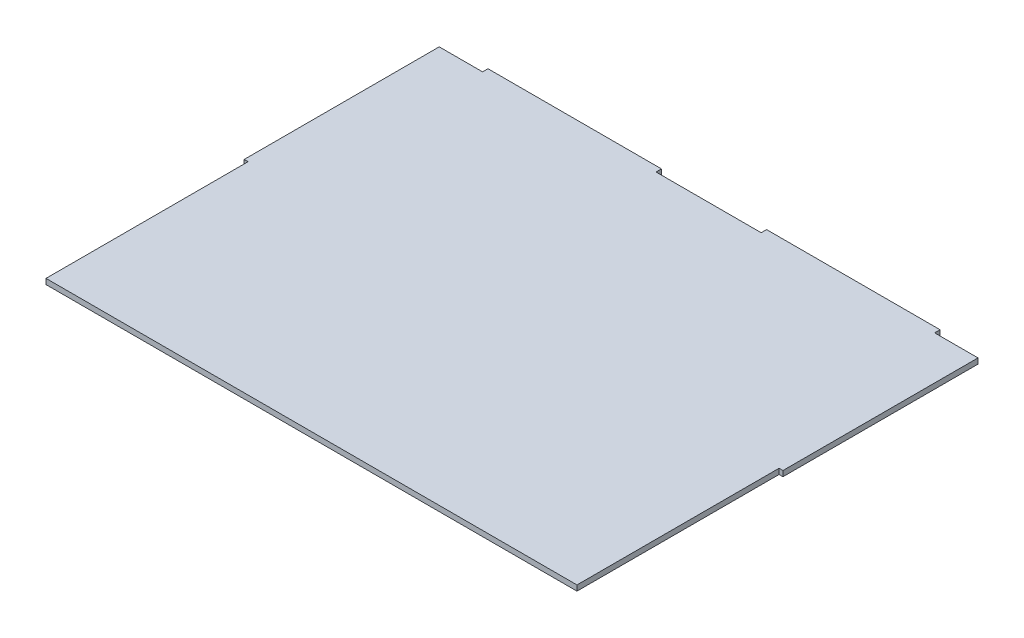
ISO-10303-21;
HEADER;
FILE_DESCRIPTION(('STEP AP214'),'2;1');
FILE_NAME('part.step','',(''),(''),'','','');
FILE_SCHEMA(('AUTOMOTIVE_DESIGN { 1 0 10303 214 1 1 1 1 }'));
ENDSEC;
DATA;
#1=APPLICATION_CONTEXT('core data for automotive mechanical design processes');
#2=APPLICATION_PROTOCOL_DEFINITION('international standard','automotive_design',2000,#1);
#3=PRODUCT_CONTEXT('',#1,'mechanical');
#4=PRODUCT('Part','Part','',(#3));
#5=PRODUCT_RELATED_PRODUCT_CATEGORY('part','',(#4));
#6=PRODUCT_DEFINITION_FORMATION('','',#4);
#7=PRODUCT_DEFINITION_CONTEXT('part definition',#1,'design');
#8=PRODUCT_DEFINITION('design','',#6,#7);
#9=PRODUCT_DEFINITION_SHAPE('','',#8);
#10=(LENGTH_UNIT() NAMED_UNIT(*) SI_UNIT(.MILLI.,.METRE.));
#11=(NAMED_UNIT(*) PLANE_ANGLE_UNIT() SI_UNIT($,.RADIAN.));
#12=(NAMED_UNIT(*) SI_UNIT($,.STERADIAN.) SOLID_ANGLE_UNIT());
#13=UNCERTAINTY_MEASURE_WITH_UNIT(LENGTH_MEASURE(1.E-05),#10,'distance_accuracy_value','');
#14=(GEOMETRIC_REPRESENTATION_CONTEXT(3) GLOBAL_UNCERTAINTY_ASSIGNED_CONTEXT((#13)) GLOBAL_UNIT_ASSIGNED_CONTEXT((#10,
#11,#12)) REPRESENTATION_CONTEXT('',''));
#15=CARTESIAN_POINT('',(0.,0.,0.));
#16=DIRECTION('',(0.,0.,1.));
#17=DIRECTION('',(1.,0.,0.));
#18=AXIS2_PLACEMENT_3D('',#15,#16,#17);
#19=CARTESIAN_POINT('',(-157.7875,1.5875,235.775));
#20=DIRECTION('',(0.,-1.,0.));
#21=DIRECTION('',(0.,0.,-1.));
#22=AXIS2_PLACEMENT_3D('',#19,#20,#21);
#23=PLANE('',#22);
#24=DIRECTION('',(-1.,0.,0.));
#25=VECTOR('',#24,1.);
#26=CARTESIAN_POINT('',(-157.7875,1.5875,117.411));
#27=LINE('',#26,#25);
#28=CARTESIAN_POINT('',(157.7875,1.5875,117.411));
#29=VERTEX_POINT('',#28);
#30=CARTESIAN_POINT('',(155.5015,1.5875,117.411));
#31=VERTEX_POINT('',#30);
#32=EDGE_CURVE('E156',#29,#31,#27,.T.);
#33=ORIENTED_EDGE('',*,*,#32,.F.);
#34=DIRECTION('',(0.,0.,-1.));
#35=VECTOR('',#34,1.);
#36=CARTESIAN_POINT('',(157.7875,1.5875,235.775));
#37=LINE('',#36,#35);
#38=CARTESIAN_POINT('',(157.7875,1.5875,3.175));
#39=VERTEX_POINT('',#38);
#40=EDGE_CURVE('E273',#29,#39,#37,.T.);
#41=ORIENTED_EDGE('',*,*,#40,.T.);
#42=DIRECTION('',(1.,0.,0.));
#43=VECTOR('',#42,1.);
#44=CARTESIAN_POINT('',(0.,1.5875,3.175));
#45=LINE('',#44,#43);
#46=CARTESIAN_POINT('',(132.3875,1.5875,3.175));
#47=VERTEX_POINT('',#46);
#48=EDGE_CURVE('E200',#47,#39,#45,.T.);
#49=ORIENTED_EDGE('',*,*,#48,.F.);
#50=DIRECTION('',(0.,0.,-1.));
#51=VECTOR('',#50,1.);
#52=CARTESIAN_POINT('',(132.3875,1.5875,3.175));
#53=LINE('',#52,#51);
#54=CARTESIAN_POINT('',(132.3875,1.5875,0.));
#55=VERTEX_POINT('',#54);
#56=EDGE_CURVE('E209',#47,#55,#53,.T.);
#57=ORIENTED_EDGE('',*,*,#56,.T.);
#58=DIRECTION('',(-1.,0.,0.));
#59=VECTOR('',#58,1.);
#60=CARTESIAN_POINT('',(-157.7875,1.5875,0.));
#61=LINE('',#60,#59);
#62=CARTESIAN_POINT('',(30.7875000000001,1.5875,0.));
#63=VERTEX_POINT('',#62);
#64=EDGE_CURVE('E264',#55,#63,#61,.T.);
#65=ORIENTED_EDGE('',*,*,#64,.T.);
#66=DIRECTION('',(0.,0.,-1.));
#67=VECTOR('',#66,1.);
#68=CARTESIAN_POINT('',(30.7875000000001,1.5875,3.175));
#69=LINE('',#68,#67);
#70=CARTESIAN_POINT('',(30.7875000000001,1.5875,3.175));
#71=VERTEX_POINT('',#70);
#72=EDGE_CURVE('E234',#71,#63,#69,.T.);
#73=ORIENTED_EDGE('',*,*,#72,.F.);
#74=DIRECTION('',(1.,0.,0.));
#75=VECTOR('',#74,1.);
#76=CARTESIAN_POINT('',(0.,1.5875,3.175));
#77=LINE('',#76,#75);
#78=CARTESIAN_POINT('',(-30.7875000000001,1.5875,3.175));
#79=VERTEX_POINT('',#78);
#80=EDGE_CURVE('E221',#79,#71,#77,.T.);
#81=ORIENTED_EDGE('',*,*,#80,.F.);
#82=DIRECTION('',(0.,0.,-1.));
#83=VECTOR('',#82,1.);
#84=CARTESIAN_POINT('',(-30.7875000000001,1.5875,3.175));
#85=LINE('',#84,#83);
#86=CARTESIAN_POINT('',(-30.7875000000001,1.5875,0.));
#87=VERTEX_POINT('',#86);
#88=EDGE_CURVE('E236',#79,#87,#85,.T.);
#89=ORIENTED_EDGE('',*,*,#88,.T.);
#90=CARTESIAN_POINT('',(-132.3875,1.5875,0.));
#91=VERTEX_POINT('',#90);
#92=EDGE_CURVE('E212',#87,#91,#61,.T.);
#93=ORIENTED_EDGE('',*,*,#92,.T.);
#94=DIRECTION('',(0.,0.,-1.));
#95=VECTOR('',#94,1.);
#96=CARTESIAN_POINT('',(-132.3875,1.5875,3.175));
#97=LINE('',#96,#95);
#98=CARTESIAN_POINT('',(-132.3875,1.5875,3.175));
#99=VERTEX_POINT('',#98);
#100=EDGE_CURVE('E229',#99,#91,#97,.T.);
#101=ORIENTED_EDGE('',*,*,#100,.F.);
#102=DIRECTION('',(1.,0.,0.));
#103=VECTOR('',#102,1.);
#104=CARTESIAN_POINT('',(0.,1.5875,3.175));
#105=LINE('',#104,#103);
#106=CARTESIAN_POINT('',(-157.7875,1.5875,3.175));
#107=VERTEX_POINT('',#106);
#108=EDGE_CURVE('E248',#107,#99,#105,.T.);
#109=ORIENTED_EDGE('',*,*,#108,.F.);
#110=DIRECTION('',(0.,0.,-1.));
#111=VECTOR('',#110,1.);
#112=CARTESIAN_POINT('',(-157.7875,1.5875,235.775));
#113=LINE('',#112,#111);
#114=CARTESIAN_POINT('',(-157.7875,1.5875,117.411));
#115=VERTEX_POINT('',#114);
#116=EDGE_CURVE('E271',#115,#107,#113,.T.);
#117=ORIENTED_EDGE('',*,*,#116,.F.);
#118=DIRECTION('',(1.,0.,0.));
#119=VECTOR('',#118,1.);
#120=CARTESIAN_POINT('',(-157.7875,1.5875,117.411));
#121=LINE('',#120,#119);
#122=CARTESIAN_POINT('',(-155.5015,1.5875,117.411));
#123=VERTEX_POINT('',#122);
#124=EDGE_CURVE('E189',#115,#123,#121,.T.);
#125=ORIENTED_EDGE('',*,*,#124,.T.);
#126=DIRECTION('',(0.,0.,-1.));
#127=VECTOR('',#126,1.);
#128=CARTESIAN_POINT('',(-155.5015,1.5875,235.775));
#129=LINE('',#128,#127);
#130=CARTESIAN_POINT('',(-155.5015,1.5875,235.775));
#131=VERTEX_POINT('',#130);
#132=EDGE_CURVE('E187',#131,#123,#129,.T.);
#133=ORIENTED_EDGE('',*,*,#132,.F.);
#134=DIRECTION('',(-1.,0.,0.));
#135=VECTOR('',#134,1.);
#136=CARTESIAN_POINT('',(-157.7875,1.5875,235.775));
#137=LINE('',#136,#135);
#138=CARTESIAN_POINT('',(155.5015,1.5875,235.775));
#139=VERTEX_POINT('',#138);
#140=EDGE_CURVE('E257',#139,#131,#137,.T.);
#141=ORIENTED_EDGE('',*,*,#140,.F.);
#142=DIRECTION('',(0.,0.,-1.));
#143=VECTOR('',#142,1.);
#144=CARTESIAN_POINT('',(155.5015,1.5875,235.775));
#145=LINE('',#144,#143);
#146=EDGE_CURVE('E177',#139,#31,#145,.T.);
#147=ORIENTED_EDGE('',*,*,#146,.T.);
#148=EDGE_LOOP('',(#33,#41,#49,#57,#65,#73,#81,#89,#93,#101,#109,#117,#125,#133,#141,#147));
#149=FACE_BOUND('',#148,.T.);
#150=ADVANCED_FACE('F41',(#149),#23,.F.);
#151=CARTESIAN_POINT('',(-157.7875,-1.5875,235.775));
#152=DIRECTION('',(0.,1.,0.));
#153=DIRECTION('',(0.,0.,1.));
#154=AXIS2_PLACEMENT_3D('',#151,#152,#153);
#155=PLANE('',#154);
#156=DIRECTION('',(-1.,0.,0.));
#157=VECTOR('',#156,1.);
#158=CARTESIAN_POINT('',(0.,-1.5875,117.411));
#159=LINE('',#158,#157);
#160=CARTESIAN_POINT('',(157.7875,-1.5875,117.411));
#161=VERTEX_POINT('',#160);
#162=CARTESIAN_POINT('',(155.5015,-1.5875,117.411));
#163=VERTEX_POINT('',#162);
#164=EDGE_CURVE('E55',#161,#163,#159,.T.);
#165=ORIENTED_EDGE('',*,*,#164,.T.);
#166=DIRECTION('',(0.,0.,-1.));
#167=VECTOR('',#166,1.);
#168=CARTESIAN_POINT('',(155.5015,-1.5875,0.));
#169=LINE('',#168,#167);
#170=CARTESIAN_POINT('',(155.5015,-1.5875,235.775));
#171=VERTEX_POINT('',#170);
#172=EDGE_CURVE('E162',#171,#163,#169,.T.);
#173=ORIENTED_EDGE('',*,*,#172,.F.);
#174=DIRECTION('',(1.,0.,0.));
#175=VECTOR('',#174,1.);
#176=CARTESIAN_POINT('',(-157.7875,-1.5875,235.775));
#177=LINE('',#176,#175);
#178=CARTESIAN_POINT('',(-155.5015,-1.5875,235.775));
#179=VERTEX_POINT('',#178);
#180=EDGE_CURVE('E259',#179,#171,#177,.T.);
#181=ORIENTED_EDGE('',*,*,#180,.F.);
#182=DIRECTION('',(0.,0.,-1.));
#183=VECTOR('',#182,1.);
#184=CARTESIAN_POINT('',(-155.5015,-1.5875,0.));
#185=LINE('',#184,#183);
#186=CARTESIAN_POINT('',(-155.5015,-1.5875,117.411));
#187=VERTEX_POINT('',#186);
#188=EDGE_CURVE('E63',#179,#187,#185,.T.);
#189=ORIENTED_EDGE('',*,*,#188,.T.);
#190=DIRECTION('',(1.,0.,0.));
#191=VECTOR('',#190,1.);
#192=CARTESIAN_POINT('',(0.,-1.5875,117.411));
#193=LINE('',#192,#191);
#194=CARTESIAN_POINT('',(-157.7875,-1.5875,117.411));
#195=VERTEX_POINT('',#194);
#196=EDGE_CURVE('E180',#195,#187,#193,.T.);
#197=ORIENTED_EDGE('',*,*,#196,.F.);
#198=DIRECTION('',(0.,0.,-1.));
#199=VECTOR('',#198,1.);
#200=CARTESIAN_POINT('',(-157.7875,-1.5875,235.775));
#201=LINE('',#200,#199);
#202=CARTESIAN_POINT('',(-157.7875,-1.5875,3.175));
#203=VERTEX_POINT('',#202);
#204=EDGE_CURVE('E269',#195,#203,#201,.T.);
#205=ORIENTED_EDGE('',*,*,#204,.T.);
#206=DIRECTION('',(-1.,0.,0.));
#207=VECTOR('',#206,1.);
#208=CARTESIAN_POINT('',(0.,-1.5875,3.175));
#209=LINE('',#208,#207);
#210=CARTESIAN_POINT('',(-132.3875,-1.5875,3.175));
#211=VERTEX_POINT('',#210);
#212=EDGE_CURVE('E242',#211,#203,#209,.T.);
#213=ORIENTED_EDGE('',*,*,#212,.F.);
#214=DIRECTION('',(0.,0.,-1.));
#215=VECTOR('',#214,1.);
#216=CARTESIAN_POINT('',(-132.3875,-1.5875,3.175));
#217=LINE('',#216,#215);
#218=CARTESIAN_POINT('',(-132.3875,-1.5875,0.));
#219=VERTEX_POINT('',#218);
#220=EDGE_CURVE('E251',#211,#219,#217,.T.);
#221=ORIENTED_EDGE('',*,*,#220,.T.);
#222=DIRECTION('',(1.,0.,0.));
#223=VECTOR('',#222,1.);
#224=CARTESIAN_POINT('',(-157.7875,-1.5875,0.));
#225=LINE('',#224,#223);
#226=CARTESIAN_POINT('',(-30.7875000000001,-1.5875,0.));
#227=VERTEX_POINT('',#226);
#228=EDGE_CURVE('E260',#219,#227,#225,.T.);
#229=ORIENTED_EDGE('',*,*,#228,.T.);
#230=DIRECTION('',(0.,0.,-1.));
#231=VECTOR('',#230,1.);
#232=CARTESIAN_POINT('',(-30.7875000000001,-1.5875,3.175));
#233=LINE('',#232,#231);
#234=CARTESIAN_POINT('',(-30.7875000000001,-1.5875,3.175));
#235=VERTEX_POINT('',#234);
#236=EDGE_CURVE('E226',#235,#227,#233,.T.);
#237=ORIENTED_EDGE('',*,*,#236,.F.);
#238=DIRECTION('',(-1.,0.,0.));
#239=VECTOR('',#238,1.);
#240=CARTESIAN_POINT('',(0.,-1.5875,3.175));
#241=LINE('',#240,#239);
#242=CARTESIAN_POINT('',(30.7875000000001,-1.5875,3.175));
#243=VERTEX_POINT('',#242);
#244=EDGE_CURVE('E214',#243,#235,#241,.T.);
#245=ORIENTED_EDGE('',*,*,#244,.F.);
#246=DIRECTION('',(0.,0.,-1.));
#247=VECTOR('',#246,1.);
#248=CARTESIAN_POINT('',(30.7875000000001,-1.5875,3.175));
#249=LINE('',#248,#247);
#250=CARTESIAN_POINT('',(30.7875000000001,-1.5875,0.));
#251=VERTEX_POINT('',#250);
#252=EDGE_CURVE('E208',#243,#251,#249,.T.);
#253=ORIENTED_EDGE('',*,*,#252,.T.);
#254=CARTESIAN_POINT('',(132.3875,-1.5875,0.));
#255=VERTEX_POINT('',#254);
#256=EDGE_CURVE('E265',#251,#255,#225,.T.);
#257=ORIENTED_EDGE('',*,*,#256,.T.);
#258=DIRECTION('',(0.,0.,-1.));
#259=VECTOR('',#258,1.);
#260=CARTESIAN_POINT('',(132.3875,-1.5875,3.175));
#261=LINE('',#260,#259);
#262=CARTESIAN_POINT('',(132.3875,-1.5875,3.175));
#263=VERTEX_POINT('',#262);
#264=EDGE_CURVE('E206',#263,#255,#261,.T.);
#265=ORIENTED_EDGE('',*,*,#264,.F.);
#266=DIRECTION('',(-1.,0.,0.));
#267=VECTOR('',#266,1.);
#268=CARTESIAN_POINT('',(0.,-1.5875,3.175));
#269=LINE('',#268,#267);
#270=CARTESIAN_POINT('',(157.7875,-1.5875,3.175));
#271=VERTEX_POINT('',#270);
#272=EDGE_CURVE('E193',#271,#263,#269,.T.);
#273=ORIENTED_EDGE('',*,*,#272,.F.);
#274=DIRECTION('',(0.,0.,-1.));
#275=VECTOR('',#274,1.);
#276=CARTESIAN_POINT('',(157.7875,-1.5875,235.775));
#277=LINE('',#276,#275);
#278=EDGE_CURVE('E172',#161,#271,#277,.T.);
#279=ORIENTED_EDGE('',*,*,#278,.F.);
#280=EDGE_LOOP('',(#165,#173,#181,#189,#197,#205,#213,#221,#229,#237,#245,#253,#257,#265,#273,#279));
#281=FACE_BOUND('',#280,.T.);
#282=ADVANCED_FACE('F170',(#281),#155,.F.);
#283=CARTESIAN_POINT('',(157.7875,-1.5875,235.775));
#284=DIRECTION('',(-1.,0.,0.));
#285=DIRECTION('',(0.,0.,1.));
#286=AXIS2_PLACEMENT_3D('',#283,#284,#285);
#287=PLANE('',#286);
#288=DIRECTION('',(0.,1.,0.));
#289=VECTOR('',#288,1.);
#290=CARTESIAN_POINT('',(157.7875,-1.5875,117.411));
#291=LINE('',#290,#289);
#292=EDGE_CURVE('E11',#161,#29,#291,.T.);
#293=ORIENTED_EDGE('',*,*,#292,.F.);
#294=ORIENTED_EDGE('',*,*,#278,.T.);
#295=DIRECTION('',(0.,-1.,0.));
#296=VECTOR('',#295,1.);
#297=CARTESIAN_POINT('',(157.7875,0.,3.175));
#298=LINE('',#297,#296);
#299=EDGE_CURVE('E203',#39,#271,#298,.T.);
#300=ORIENTED_EDGE('',*,*,#299,.F.);
#301=ORIENTED_EDGE('',*,*,#40,.F.);
#302=EDGE_LOOP('',(#293,#294,#300,#301));
#303=FACE_BOUND('',#302,.T.);
#304=ADVANCED_FACE('F43',(#303),#287,.F.);
#305=CARTESIAN_POINT('',(0.,0.,235.775));
#306=DIRECTION('',(0.,0.,-1.));
#307=DIRECTION('',(-1.,0.,0.));
#308=AXIS2_PLACEMENT_3D('',#305,#306,#307);
#309=PLANE('',#308);
#310=ORIENTED_EDGE('',*,*,#180,.T.);
#311=DIRECTION('',(0.,-1.,0.));
#312=VECTOR('',#311,1.);
#313=CARTESIAN_POINT('',(155.5015,1.587512,235.775));
#314=LINE('',#313,#312);
#315=EDGE_CURVE('E159',#139,#171,#314,.T.);
#316=ORIENTED_EDGE('',*,*,#315,.F.);
#317=ORIENTED_EDGE('',*,*,#140,.T.);
#318=DIRECTION('',(0.,1.,0.));
#319=VECTOR('',#318,1.);
#320=CARTESIAN_POINT('',(-155.5015,0.,235.775));
#321=LINE('',#320,#319);
#322=EDGE_CURVE('E49',#179,#131,#321,.T.);
#323=ORIENTED_EDGE('',*,*,#322,.F.);
#324=EDGE_LOOP('',(#310,#316,#317,#323));
#325=FACE_BOUND('',#324,.T.);
#326=ADVANCED_FACE('F328',(#325),#309,.F.);
#327=CARTESIAN_POINT('',(-157.7875,-1.5875,235.775));
#328=DIRECTION('',(1.,0.,0.));
#329=DIRECTION('',(0.,0.,-1.));
#330=AXIS2_PLACEMENT_3D('',#327,#328,#329);
#331=PLANE('',#330);
#332=ORIENTED_EDGE('',*,*,#204,.F.);
#333=DIRECTION('',(0.,-1.,0.));
#334=VECTOR('',#333,1.);
#335=CARTESIAN_POINT('',(-157.7875,1.587512,117.411));
#336=LINE('',#335,#334);
#337=EDGE_CURVE('E183',#115,#195,#336,.T.);
#338=ORIENTED_EDGE('',*,*,#337,.F.);
#339=ORIENTED_EDGE('',*,*,#116,.T.);
#340=DIRECTION('',(0.,1.,0.));
#341=VECTOR('',#340,1.);
#342=CARTESIAN_POINT('',(-157.7875,0.,3.175));
#343=LINE('',#342,#341);
#344=EDGE_CURVE('E245',#203,#107,#343,.T.);
#345=ORIENTED_EDGE('',*,*,#344,.F.);
#346=EDGE_LOOP('',(#332,#338,#339,#345));
#347=FACE_BOUND('',#346,.T.);
#348=ADVANCED_FACE('F288',(#347),#331,.F.);
#349=CARTESIAN_POINT('',(0.,0.,0.));
#350=DIRECTION('',(0.,0.,-1.));
#351=DIRECTION('',(-1.,0.,0.));
#352=AXIS2_PLACEMENT_3D('',#349,#350,#351);
#353=PLANE('',#352);
#354=DIRECTION('',(0.,1.,0.));
#355=VECTOR('',#354,1.);
#356=CARTESIAN_POINT('',(132.3875,0.,0.));
#357=LINE('',#356,#355);
#358=EDGE_CURVE('E197',#255,#55,#357,.T.);
#359=ORIENTED_EDGE('',*,*,#358,.F.);
#360=ORIENTED_EDGE('',*,*,#256,.F.);
#361=DIRECTION('',(0.,1.,0.));
#362=VECTOR('',#361,1.);
#363=CARTESIAN_POINT('',(30.7875000000001,0.,0.));
#364=LINE('',#363,#362);
#365=EDGE_CURVE('E218',#251,#63,#364,.T.);
#366=ORIENTED_EDGE('',*,*,#365,.T.);
#367=ORIENTED_EDGE('',*,*,#64,.F.);
#368=EDGE_LOOP('',(#359,#360,#366,#367));
#369=FACE_BOUND('',#368,.T.);
#370=ADVANCED_FACE('F318',(#369),#353,.T.);
#371=DIRECTION('',(0.,1.,0.));
#372=VECTOR('',#371,1.);
#373=CARTESIAN_POINT('',(-30.7875000000001,0.,0.));
#374=LINE('',#373,#372);
#375=EDGE_CURVE('E227',#227,#87,#374,.T.);
#376=ORIENTED_EDGE('',*,*,#375,.F.);
#377=ORIENTED_EDGE('',*,*,#228,.F.);
#378=DIRECTION('',(0.,1.,0.));
#379=VECTOR('',#378,1.);
#380=CARTESIAN_POINT('',(-132.3875,0.,0.));
#381=LINE('',#380,#379);
#382=EDGE_CURVE('E192',#219,#91,#381,.T.);
#383=ORIENTED_EDGE('',*,*,#382,.T.);
#384=ORIENTED_EDGE('',*,*,#92,.F.);
#385=EDGE_LOOP('',(#376,#377,#383,#384));
#386=FACE_BOUND('',#385,.T.);
#387=ADVANCED_FACE('F302',(#386),#353,.T.);
#388=CARTESIAN_POINT('',(-132.3875,0.,3.175));
#389=DIRECTION('',(-1.,0.,0.));
#390=DIRECTION('',(0.,0.,1.));
#391=AXIS2_PLACEMENT_3D('',#388,#389,#390);
#392=PLANE('',#391);
#393=ORIENTED_EDGE('',*,*,#382,.F.);
#394=ORIENTED_EDGE('',*,*,#220,.F.);
#395=DIRECTION('',(0.,1.,0.));
#396=VECTOR('',#395,1.);
#397=CARTESIAN_POINT('',(-132.3875,0.,3.175));
#398=LINE('',#397,#396);
#399=EDGE_CURVE('E240',#211,#99,#398,.T.);
#400=ORIENTED_EDGE('',*,*,#399,.T.);
#401=ORIENTED_EDGE('',*,*,#100,.T.);
#402=EDGE_LOOP('',(#393,#394,#400,#401));
#403=FACE_BOUND('',#402,.T.);
#404=ADVANCED_FACE('F296',(#403),#392,.T.);
#405=CARTESIAN_POINT('',(0.,0.,3.175));
#406=DIRECTION('',(0.,0.,-1.));
#407=DIRECTION('',(-1.,0.,0.));
#408=AXIS2_PLACEMENT_3D('',#405,#406,#407);
#409=PLANE('',#408);
#410=ORIENTED_EDGE('',*,*,#399,.F.);
#411=ORIENTED_EDGE('',*,*,#212,.T.);
#412=ORIENTED_EDGE('',*,*,#344,.T.);
#413=ORIENTED_EDGE('',*,*,#108,.T.);
#414=EDGE_LOOP('',(#410,#411,#412,#413));
#415=FACE_BOUND('',#414,.T.);
#416=ADVANCED_FACE('F293',(#415),#409,.T.);
#417=CARTESIAN_POINT('',(30.7875000000001,0.,3.175));
#418=DIRECTION('',(-1.,0.,0.));
#419=DIRECTION('',(0.,-1.,0.));
#420=AXIS2_PLACEMENT_3D('',#417,#418,#419);
#421=PLANE('',#420);
#422=ORIENTED_EDGE('',*,*,#365,.F.);
#423=ORIENTED_EDGE('',*,*,#252,.F.);
#424=DIRECTION('',(0.,1.,0.));
#425=VECTOR('',#424,1.);
#426=CARTESIAN_POINT('',(30.7875000000001,0.,3.175));
#427=LINE('',#426,#425);
#428=EDGE_CURVE('E224',#243,#71,#427,.T.);
#429=ORIENTED_EDGE('',*,*,#428,.T.);
#430=ORIENTED_EDGE('',*,*,#72,.T.);
#431=EDGE_LOOP('',(#422,#423,#429,#430));
#432=FACE_BOUND('',#431,.T.);
#433=ADVANCED_FACE('F353',(#432),#421,.T.);
#434=CARTESIAN_POINT('',(-30.7875000000001,0.,3.175));
#435=DIRECTION('',(-1.,0.,0.));
#436=DIRECTION('',(0.,-1.,0.));
#437=AXIS2_PLACEMENT_3D('',#434,#435,#436);
#438=PLANE('',#437);
#439=ORIENTED_EDGE('',*,*,#375,.T.);
#440=ORIENTED_EDGE('',*,*,#88,.F.);
#441=DIRECTION('',(0.,1.,0.));
#442=VECTOR('',#441,1.);
#443=CARTESIAN_POINT('',(-30.7875000000001,0.,3.175));
#444=LINE('',#443,#442);
#445=EDGE_CURVE('E217',#235,#79,#444,.T.);
#446=ORIENTED_EDGE('',*,*,#445,.F.);
#447=ORIENTED_EDGE('',*,*,#236,.T.);
#448=EDGE_LOOP('',(#439,#440,#446,#447));
#449=FACE_BOUND('',#448,.T.);
#450=ADVANCED_FACE('F305',(#449),#438,.F.);
#451=CARTESIAN_POINT('',(0.,0.,3.175));
#452=DIRECTION('',(0.,0.,-1.));
#453=DIRECTION('',(-1.,0.,0.));
#454=AXIS2_PLACEMENT_3D('',#451,#452,#453);
#455=PLANE('',#454);
#456=ORIENTED_EDGE('',*,*,#244,.T.);
#457=ORIENTED_EDGE('',*,*,#445,.T.);
#458=ORIENTED_EDGE('',*,*,#80,.T.);
#459=ORIENTED_EDGE('',*,*,#428,.F.);
#460=EDGE_LOOP('',(#456,#457,#458,#459));
#461=FACE_BOUND('',#460,.T.);
#462=ADVANCED_FACE('F311',(#461),#455,.T.);
#463=CARTESIAN_POINT('',(132.3875,0.,3.175));
#464=DIRECTION('',(-1.,0.,0.));
#465=DIRECTION('',(0.,0.,1.));
#466=AXIS2_PLACEMENT_3D('',#463,#464,#465);
#467=PLANE('',#466);
#468=ORIENTED_EDGE('',*,*,#358,.T.);
#469=ORIENTED_EDGE('',*,*,#56,.F.);
#470=DIRECTION('',(0.,1.,0.));
#471=VECTOR('',#470,1.);
#472=CARTESIAN_POINT('',(132.3875,0.,3.175));
#473=LINE('',#472,#471);
#474=EDGE_CURVE('E196',#263,#47,#473,.T.);
#475=ORIENTED_EDGE('',*,*,#474,.F.);
#476=ORIENTED_EDGE('',*,*,#264,.T.);
#477=EDGE_LOOP('',(#468,#469,#475,#476));
#478=FACE_BOUND('',#477,.T.);
#479=ADVANCED_FACE('F321',(#478),#467,.F.);
#480=CARTESIAN_POINT('',(0.,0.,3.175));
#481=DIRECTION('',(0.,0.,-1.));
#482=DIRECTION('',(-1.,0.,0.));
#483=AXIS2_PLACEMENT_3D('',#480,#481,#482);
#484=PLANE('',#483);
#485=ORIENTED_EDGE('',*,*,#272,.T.);
#486=ORIENTED_EDGE('',*,*,#474,.T.);
#487=ORIENTED_EDGE('',*,*,#48,.T.);
#488=ORIENTED_EDGE('',*,*,#299,.T.);
#489=EDGE_LOOP('',(#485,#486,#487,#488));
#490=FACE_BOUND('',#489,.T.);
#491=ADVANCED_FACE('F326',(#490),#484,.T.);
#492=CARTESIAN_POINT('',(0.,1.587512,117.411));
#493=DIRECTION('',(0.,0.,-1.));
#494=DIRECTION('',(-1.,0.,0.));
#495=AXIS2_PLACEMENT_3D('',#492,#493,#494);
#496=PLANE('',#495);
#497=ORIENTED_EDGE('',*,*,#337,.T.);
#498=ORIENTED_EDGE('',*,*,#196,.T.);
#499=DIRECTION('',(0.,-1.,0.));
#500=VECTOR('',#499,1.);
#501=CARTESIAN_POINT('',(-155.5015,1.587512,117.411));
#502=LINE('',#501,#500);
#503=EDGE_CURVE('E185',#123,#187,#502,.T.);
#504=ORIENTED_EDGE('',*,*,#503,.F.);
#505=ORIENTED_EDGE('',*,*,#124,.F.);
#506=EDGE_LOOP('',(#497,#498,#504,#505));
#507=FACE_BOUND('',#506,.T.);
#508=ADVANCED_FACE('F284',(#507),#496,.F.);
#509=CARTESIAN_POINT('',(-155.5015,1.587512,0.));
#510=DIRECTION('',(-1.,0.,0.));
#511=DIRECTION('',(0.,0.,1.));
#512=AXIS2_PLACEMENT_3D('',#509,#510,#511);
#513=PLANE('',#512);
#514=ORIENTED_EDGE('',*,*,#132,.T.);
#515=ORIENTED_EDGE('',*,*,#503,.T.);
#516=ORIENTED_EDGE('',*,*,#188,.F.);
#517=ORIENTED_EDGE('',*,*,#322,.T.);
#518=EDGE_LOOP('',(#514,#515,#516,#517));
#519=FACE_BOUND('',#518,.T.);
#520=ADVANCED_FACE('F275',(#519),#513,.T.);
#521=CARTESIAN_POINT('',(155.5015,1.587512,0.));
#522=DIRECTION('',(-1.,0.,0.));
#523=DIRECTION('',(0.,0.,1.));
#524=AXIS2_PLACEMENT_3D('',#521,#522,#523);
#525=PLANE('',#524);
#526=ORIENTED_EDGE('',*,*,#315,.T.);
#527=ORIENTED_EDGE('',*,*,#172,.T.);
#528=DIRECTION('',(0.,-1.,0.));
#529=VECTOR('',#528,1.);
#530=CARTESIAN_POINT('',(155.5015,1.587512,117.411));
#531=LINE('',#530,#529);
#532=EDGE_CURVE('E152',#31,#163,#531,.T.);
#533=ORIENTED_EDGE('',*,*,#532,.F.);
#534=ORIENTED_EDGE('',*,*,#146,.F.);
#535=EDGE_LOOP('',(#526,#527,#533,#534));
#536=FACE_BOUND('',#535,.T.);
#537=ADVANCED_FACE('F163',(#536),#525,.F.);
#538=CARTESIAN_POINT('',(0.,1.587512,117.411));
#539=DIRECTION('',(0.,0.,1.));
#540=DIRECTION('',(1.,0.,0.));
#541=AXIS2_PLACEMENT_3D('',#538,#539,#540);
#542=PLANE('',#541);
#543=ORIENTED_EDGE('',*,*,#32,.T.);
#544=ORIENTED_EDGE('',*,*,#532,.T.);
#545=ORIENTED_EDGE('',*,*,#164,.F.);
#546=ORIENTED_EDGE('',*,*,#292,.T.);
#547=EDGE_LOOP('',(#543,#544,#545,#546));
#548=FACE_BOUND('',#547,.T.);
#549=ADVANCED_FACE('F154',(#548),#542,.T.);
#550=CLOSED_SHELL('',(#150,#282,#304,#326,#348,#370,#387,#404,#416,#433,#450,#462,#479,#491,
#508,#520,#537,#549));
#551=MANIFOLD_SOLID_BREP('B2',#550);
#552=ADVANCED_BREP_SHAPE_REPRESENTATION('',(#18,#551),#14);
#553=SHAPE_DEFINITION_REPRESENTATION(#9,#552);
ENDSEC;
END-ISO-10303-21;
